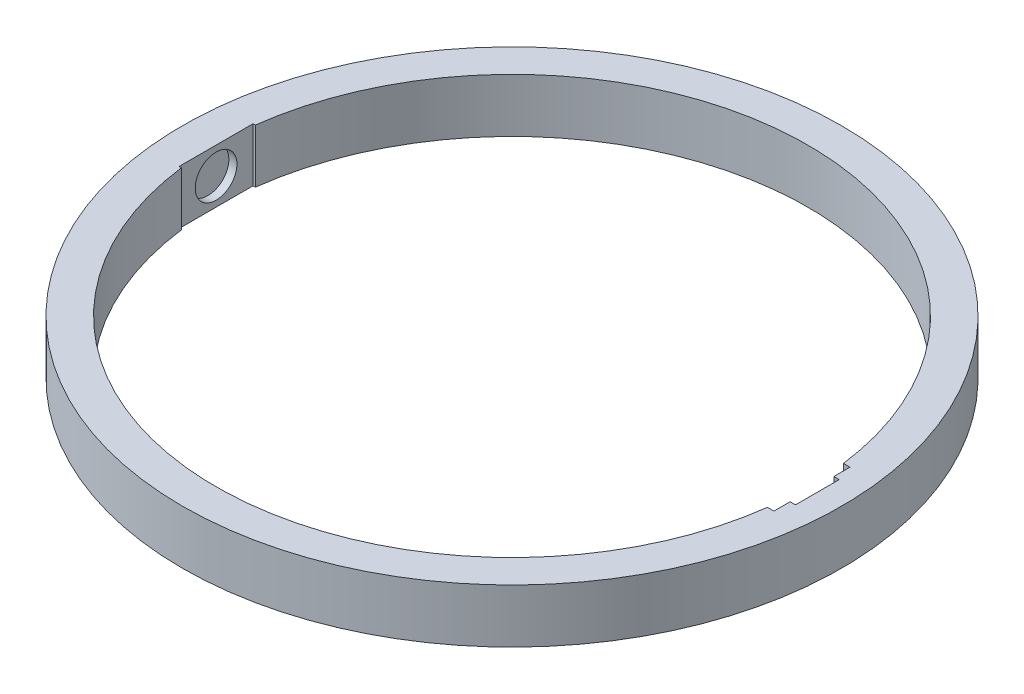
ISO-10303-21;
HEADER;
FILE_DESCRIPTION(('STEP AP214'),'2;1');
FILE_NAME('part.step','',(''),(''),'','','');
FILE_SCHEMA(('AUTOMOTIVE_DESIGN { 1 0 10303 214 1 1 1 1 }'));
ENDSEC;
DATA;
#1=APPLICATION_CONTEXT('core data for automotive mechanical design processes');
#2=APPLICATION_PROTOCOL_DEFINITION('international standard','automotive_design',2000,#1);
#3=PRODUCT_CONTEXT('',#1,'mechanical');
#4=PRODUCT('Part','Part','',(#3));
#5=PRODUCT_RELATED_PRODUCT_CATEGORY('part','',(#4));
#6=PRODUCT_DEFINITION_FORMATION('','',#4);
#7=PRODUCT_DEFINITION_CONTEXT('part definition',#1,'design');
#8=PRODUCT_DEFINITION('design','',#6,#7);
#9=PRODUCT_DEFINITION_SHAPE('','',#8);
#10=(LENGTH_UNIT() NAMED_UNIT(*) SI_UNIT(.MILLI.,.METRE.));
#11=(NAMED_UNIT(*) PLANE_ANGLE_UNIT() SI_UNIT($,.RADIAN.));
#12=(NAMED_UNIT(*) SI_UNIT($,.STERADIAN.) SOLID_ANGLE_UNIT());
#13=UNCERTAINTY_MEASURE_WITH_UNIT(LENGTH_MEASURE(1.E-05),#10,'distance_accuracy_value','');
#14=(GEOMETRIC_REPRESENTATION_CONTEXT(3) GLOBAL_UNCERTAINTY_ASSIGNED_CONTEXT((#13)) GLOBAL_UNIT_ASSIGNED_CONTEXT((#10,
#11,#12)) REPRESENTATION_CONTEXT('',''));
#15=CARTESIAN_POINT('',(0.,0.,0.));
#16=DIRECTION('',(0.,0.,1.));
#17=DIRECTION('',(1.,0.,0.));
#18=AXIS2_PLACEMENT_3D('',#15,#16,#17);
#19=CARTESIAN_POINT('',(0.,80.,0.));
#20=DIRECTION('',(0.,1.,0.));
#21=DIRECTION('',(0.,0.,1.));
#22=AXIS2_PLACEMENT_3D('',#19,#20,#21);
#23=PLANE('',#22);
#24=CARTESIAN_POINT('',(0.,80.,0.));
#25=DIRECTION('',(0.,1.,0.));
#26=DIRECTION('',(0.,0.,1.));
#27=AXIS2_PLACEMENT_3D('',#24,#25,#26);
#28=CIRCLE('',#27,490.);
#29=CARTESIAN_POINT('',(0.,80.,490.));
#30=VERTEX_POINT('',#29);
#31=EDGE_CURVE('E219',#30,#30,#28,.T.);
#32=ORIENTED_EDGE('',*,*,#31,.T.);
#33=EDGE_LOOP('',(#32));
#34=FACE_BOUND('',#33,.T.);
#35=DIRECTION('',(0.,0.,1.));
#36=VECTOR('',#35,1.);
#37=CARTESIAN_POINT('',(-440.,80.,-55.));
#38=LINE('',#37,#36);
#39=CARTESIAN_POINT('',(-440.,80.,-55.));
#40=VERTEX_POINT('',#39);
#41=CARTESIAN_POINT('',(-440.,80.,55.));
#42=VERTEX_POINT('',#41);
#43=EDGE_CURVE('E126',#40,#42,#38,.T.);
#44=ORIENTED_EDGE('',*,*,#43,.F.);
#45=DIRECTION('',(-1.,0.,0.));
#46=VECTOR('',#45,1.);
#47=CARTESIAN_POINT('',(-430.,80.,-55.));
#48=LINE('',#47,#46);
#49=CARTESIAN_POINT('',(-436.548966325657,80.,-55.));
#50=VERTEX_POINT('',#49);
#51=EDGE_CURVE('E129',#50,#40,#48,.T.);
#52=ORIENTED_EDGE('',*,*,#51,.F.);
#53=CARTESIAN_POINT('',(0.,80.,0.));
#54=DIRECTION('',(0.,1.,0.));
#55=DIRECTION('',(0.,0.,1.));
#56=AXIS2_PLACEMENT_3D('',#53,#54,#55);
#57=CIRCLE('',#56,440.);
#58=CARTESIAN_POINT('',(436.357365011753,80.,-56.5));
#59=VERTEX_POINT('',#58);
#60=EDGE_CURVE('E212',#59,#50,#57,.T.);
#61=ORIENTED_EDGE('',*,*,#60,.F.);
#62=DIRECTION('',(-1.,0.,0.));
#63=VECTOR('',#62,1.);
#64=CARTESIAN_POINT('',(0.,80.,-56.5));
#65=LINE('',#64,#63);
#66=CARTESIAN_POINT('',(446.,80.,-56.5));
#67=VERTEX_POINT('',#66);
#68=EDGE_CURVE('E59',#67,#59,#65,.T.);
#69=ORIENTED_EDGE('',*,*,#68,.F.);
#70=DIRECTION('',(0.,0.,-1.));
#71=VECTOR('',#70,1.);
#72=CARTESIAN_POINT('',(446.,80.,0.));
#73=LINE('',#72,#71);
#74=CARTESIAN_POINT('',(446.,80.,-32.5));
#75=VERTEX_POINT('',#74);
#76=EDGE_CURVE('E209',#75,#67,#73,.T.);
#77=ORIENTED_EDGE('',*,*,#76,.F.);
#78=DIRECTION('',(-1.,0.,0.));
#79=VECTOR('',#78,1.);
#80=CARTESIAN_POINT('',(0.,80.,-32.5));
#81=LINE('',#80,#79);
#82=CARTESIAN_POINT('',(454.,80.,-32.5));
#83=VERTEX_POINT('',#82);
#84=EDGE_CURVE('E207',#83,#75,#81,.T.);
#85=ORIENTED_EDGE('',*,*,#84,.F.);
#86=DIRECTION('',(0.,0.,-1.));
#87=VECTOR('',#86,1.);
#88=CARTESIAN_POINT('',(454.,80.,0.));
#89=LINE('',#88,#87);
#90=CARTESIAN_POINT('',(454.,80.,32.5));
#91=VERTEX_POINT('',#90);
#92=EDGE_CURVE('E205',#91,#83,#89,.T.);
#93=ORIENTED_EDGE('',*,*,#92,.F.);
#94=DIRECTION('',(1.,0.,0.));
#95=VECTOR('',#94,1.);
#96=CARTESIAN_POINT('',(0.,80.,32.5));
#97=LINE('',#96,#95);
#98=CARTESIAN_POINT('',(446.,80.,32.5));
#99=VERTEX_POINT('',#98);
#100=EDGE_CURVE('E203',#99,#91,#97,.T.);
#101=ORIENTED_EDGE('',*,*,#100,.F.);
#102=DIRECTION('',(0.,0.,-1.));
#103=VECTOR('',#102,1.);
#104=CARTESIAN_POINT('',(446.,80.,0.));
#105=LINE('',#104,#103);
#106=CARTESIAN_POINT('',(446.,80.,56.5));
#107=VERTEX_POINT('',#106);
#108=EDGE_CURVE('E201',#107,#99,#105,.T.);
#109=ORIENTED_EDGE('',*,*,#108,.F.);
#110=DIRECTION('',(1.,0.,0.));
#111=VECTOR('',#110,1.);
#112=CARTESIAN_POINT('',(0.,80.,56.5));
#113=LINE('',#112,#111);
#114=CARTESIAN_POINT('',(436.357365011753,80.,56.5));
#115=VERTEX_POINT('',#114);
#116=EDGE_CURVE('E199',#115,#107,#113,.T.);
#117=ORIENTED_EDGE('',*,*,#116,.F.);
#118=CARTESIAN_POINT('',(-436.548966325657,80.,55.));
#119=VERTEX_POINT('',#118);
#120=EDGE_CURVE('E215',#119,#115,#57,.T.);
#121=ORIENTED_EDGE('',*,*,#120,.F.);
#122=DIRECTION('',(-1.,0.,0.));
#123=VECTOR('',#122,1.);
#124=CARTESIAN_POINT('',(-430.,80.,55.));
#125=LINE('',#124,#123);
#126=EDGE_CURVE('E51',#119,#42,#125,.T.);
#127=ORIENTED_EDGE('',*,*,#126,.T.);
#128=EDGE_LOOP('',(#44,#52,#61,#69,#77,#85,#93,#101,#109,#117,#121,#127));
#129=FACE_BOUND('',#128,.T.);
#130=ADVANCED_FACE('F36',(#34,#129),#23,.T.);
#131=CARTESIAN_POINT('',(0.,0.,0.));
#132=DIRECTION('',(0.,1.,0.));
#133=DIRECTION('',(0.,0.,1.));
#134=AXIS2_PLACEMENT_3D('',#131,#132,#133);
#135=PLANE('',#134);
#136=CARTESIAN_POINT('',(0.,0.,0.));
#137=DIRECTION('',(0.,1.,0.));
#138=DIRECTION('',(0.,0.,1.));
#139=AXIS2_PLACEMENT_3D('',#136,#137,#138);
#140=CIRCLE('',#139,490.);
#141=CARTESIAN_POINT('',(0.,0.,490.));
#142=VERTEX_POINT('',#141);
#143=EDGE_CURVE('E214',#142,#142,#140,.T.);
#144=ORIENTED_EDGE('',*,*,#143,.F.);
#145=EDGE_LOOP('',(#144));
#146=FACE_BOUND('',#145,.T.);
#147=DIRECTION('',(-1.,0.,0.));
#148=VECTOR('',#147,1.);
#149=CARTESIAN_POINT('',(-430.,0.,-55.));
#150=LINE('',#149,#148);
#151=CARTESIAN_POINT('',(-436.548966325657,0.,-55.));
#152=VERTEX_POINT('',#151);
#153=CARTESIAN_POINT('',(-440.,0.,-55.));
#154=VERTEX_POINT('',#153);
#155=EDGE_CURVE('E155',#152,#154,#150,.T.);
#156=ORIENTED_EDGE('',*,*,#155,.T.);
#157=DIRECTION('',(0.,0.,-1.));
#158=VECTOR('',#157,1.);
#159=CARTESIAN_POINT('',(-440.,0.,55.));
#160=LINE('',#159,#158);
#161=CARTESIAN_POINT('',(-440.,0.,55.));
#162=VERTEX_POINT('',#161);
#163=EDGE_CURVE('E145',#162,#154,#160,.T.);
#164=ORIENTED_EDGE('',*,*,#163,.F.);
#165=DIRECTION('',(-1.,0.,0.));
#166=VECTOR('',#165,1.);
#167=CARTESIAN_POINT('',(-430.,0.,55.));
#168=LINE('',#167,#166);
#169=CARTESIAN_POINT('',(-436.548966325657,0.,55.));
#170=VERTEX_POINT('',#169);
#171=EDGE_CURVE('E157',#170,#162,#168,.T.);
#172=ORIENTED_EDGE('',*,*,#171,.F.);
#173=CARTESIAN_POINT('',(0.,0.,0.));
#174=DIRECTION('',(0.,1.,0.));
#175=DIRECTION('',(0.,0.,1.));
#176=AXIS2_PLACEMENT_3D('',#173,#174,#175);
#177=CIRCLE('',#176,440.);
#178=CARTESIAN_POINT('',(436.357365011753,0.,56.5));
#179=VERTEX_POINT('',#178);
#180=EDGE_CURVE('E211',#170,#179,#177,.T.);
#181=ORIENTED_EDGE('',*,*,#180,.T.);
#182=DIRECTION('',(1.,0.,0.));
#183=VECTOR('',#182,1.);
#184=CARTESIAN_POINT('',(446.,0.,56.5));
#185=LINE('',#184,#183);
#186=CARTESIAN_POINT('',(446.,0.,56.5));
#187=VERTEX_POINT('',#186);
#188=EDGE_CURVE('E166',#179,#187,#185,.T.);
#189=ORIENTED_EDGE('',*,*,#188,.T.);
#190=DIRECTION('',(0.,0.,-1.));
#191=VECTOR('',#190,1.);
#192=CARTESIAN_POINT('',(446.,0.,32.5));
#193=LINE('',#192,#191);
#194=CARTESIAN_POINT('',(446.,0.,32.5));
#195=VERTEX_POINT('',#194);
#196=EDGE_CURVE('E169',#187,#195,#193,.T.);
#197=ORIENTED_EDGE('',*,*,#196,.T.);
#198=DIRECTION('',(1.,0.,0.));
#199=VECTOR('',#198,1.);
#200=CARTESIAN_POINT('',(454.,0.,32.5));
#201=LINE('',#200,#199);
#202=CARTESIAN_POINT('',(454.,0.,32.5));
#203=VERTEX_POINT('',#202);
#204=EDGE_CURVE('E172',#195,#203,#201,.T.);
#205=ORIENTED_EDGE('',*,*,#204,.T.);
#206=DIRECTION('',(0.,0.,-1.));
#207=VECTOR('',#206,1.);
#208=CARTESIAN_POINT('',(454.,0.,-32.5));
#209=LINE('',#208,#207);
#210=CARTESIAN_POINT('',(454.,0.,-32.5));
#211=VERTEX_POINT('',#210);
#212=EDGE_CURVE('E175',#203,#211,#209,.T.);
#213=ORIENTED_EDGE('',*,*,#212,.T.);
#214=DIRECTION('',(-1.,0.,0.));
#215=VECTOR('',#214,1.);
#216=CARTESIAN_POINT('',(446.,0.,-32.5));
#217=LINE('',#216,#215);
#218=CARTESIAN_POINT('',(446.,0.,-32.5));
#219=VERTEX_POINT('',#218);
#220=EDGE_CURVE('E178',#211,#219,#217,.T.);
#221=ORIENTED_EDGE('',*,*,#220,.T.);
#222=DIRECTION('',(0.,0.,-1.));
#223=VECTOR('',#222,1.);
#224=CARTESIAN_POINT('',(446.,0.,-56.5));
#225=LINE('',#224,#223);
#226=CARTESIAN_POINT('',(446.,0.,-56.5));
#227=VERTEX_POINT('',#226);
#228=EDGE_CURVE('E142',#219,#227,#225,.T.);
#229=ORIENTED_EDGE('',*,*,#228,.T.);
#230=DIRECTION('',(-1.,0.,0.));
#231=VECTOR('',#230,1.);
#232=CARTESIAN_POINT('',(366.03,0.,-56.5));
#233=LINE('',#232,#231);
#234=CARTESIAN_POINT('',(436.357365011753,0.,-56.5));
#235=VERTEX_POINT('',#234);
#236=EDGE_CURVE('E163',#227,#235,#233,.T.);
#237=ORIENTED_EDGE('',*,*,#236,.T.);
#238=EDGE_CURVE('E216',#235,#152,#177,.T.);
#239=ORIENTED_EDGE('',*,*,#238,.T.);
#240=EDGE_LOOP('',(#156,#164,#172,#181,#189,#197,#205,#213,#221,#229,#237,#239));
#241=FACE_BOUND('',#240,.T.);
#242=ADVANCED_FACE('F244',(#146,#241),#135,.F.);
#243=CARTESIAN_POINT('',(0.,80.,0.));
#244=DIRECTION('',(0.,-1.,0.));
#245=DIRECTION('',(0.,0.,-1.));
#246=AXIS2_PLACEMENT_3D('',#243,#244,#245);
#247=CYLINDRICAL_SURFACE('',#246,440.);
#248=ORIENTED_EDGE('',*,*,#60,.T.);
#249=DIRECTION('',(0.,-1.,0.));
#250=VECTOR('',#249,1.);
#251=CARTESIAN_POINT('',(-436.548966325657,80.,-55.));
#252=LINE('',#251,#250);
#253=EDGE_CURVE('E11',#50,#152,#252,.T.);
#254=ORIENTED_EDGE('',*,*,#253,.T.);
#255=ORIENTED_EDGE('',*,*,#238,.F.);
#256=DIRECTION('',(0.,-1.,0.));
#257=VECTOR('',#256,1.);
#258=CARTESIAN_POINT('',(436.357365011753,80.,-56.5));
#259=LINE('',#258,#257);
#260=EDGE_CURVE('E222',#59,#235,#259,.T.);
#261=ORIENTED_EDGE('',*,*,#260,.F.);
#262=EDGE_LOOP('',(#248,#254,#255,#261));
#263=FACE_BOUND('',#262,.T.);
#264=ADVANCED_FACE('F264',(#263),#247,.F.);
#265=ORIENTED_EDGE('',*,*,#180,.F.);
#266=DIRECTION('',(0.,-1.,0.));
#267=VECTOR('',#266,1.);
#268=CARTESIAN_POINT('',(-436.548966325657,80.,55.));
#269=LINE('',#268,#267);
#270=EDGE_CURVE('E44',#170,#119,#269,.F.);
#271=ORIENTED_EDGE('',*,*,#270,.T.);
#272=ORIENTED_EDGE('',*,*,#120,.T.);
#273=DIRECTION('',(0.,-1.,0.));
#274=VECTOR('',#273,1.);
#275=CARTESIAN_POINT('',(436.357365011753,80.,56.5));
#276=LINE('',#275,#274);
#277=EDGE_CURVE('E226',#179,#115,#276,.F.);
#278=ORIENTED_EDGE('',*,*,#277,.F.);
#279=EDGE_LOOP('',(#265,#271,#272,#278));
#280=FACE_BOUND('',#279,.T.);
#281=ADVANCED_FACE('F230',(#280),#247,.F.);
#282=CARTESIAN_POINT('',(0.,80.,0.));
#283=DIRECTION('',(0.,-1.,0.));
#284=DIRECTION('',(0.,0.,-1.));
#285=AXIS2_PLACEMENT_3D('',#282,#283,#284);
#286=CYLINDRICAL_SURFACE('',#285,490.);
#287=ORIENTED_EDGE('',*,*,#31,.F.);
#288=EDGE_LOOP('',(#287));
#289=FACE_BOUND('',#288,.T.);
#290=ORIENTED_EDGE('',*,*,#143,.T.);
#291=EDGE_LOOP('',(#290));
#292=FACE_BOUND('',#291,.T.);
#293=ADVANCED_FACE('F38',(#289,#292),#286,.T.);
#294=CARTESIAN_POINT('',(446.,0.,-56.5));
#295=DIRECTION('',(1.,0.,0.));
#296=DIRECTION('',(0.,0.,-1.));
#297=AXIS2_PLACEMENT_3D('',#294,#295,#296);
#298=PLANE('',#297);
#299=ORIENTED_EDGE('',*,*,#76,.T.);
#300=DIRECTION('',(0.,1.,0.));
#301=VECTOR('',#300,1.);
#302=CARTESIAN_POINT('',(446.,0.,-56.5));
#303=LINE('',#302,#301);
#304=EDGE_CURVE('E181',#227,#67,#303,.T.);
#305=ORIENTED_EDGE('',*,*,#304,.F.);
#306=ORIENTED_EDGE('',*,*,#228,.F.);
#307=DIRECTION('',(0.,1.,0.));
#308=VECTOR('',#307,1.);
#309=CARTESIAN_POINT('',(446.,0.,-32.5));
#310=LINE('',#309,#308);
#311=EDGE_CURVE('E182',#219,#75,#310,.T.);
#312=ORIENTED_EDGE('',*,*,#311,.T.);
#313=EDGE_LOOP('',(#299,#305,#306,#312));
#314=FACE_BOUND('',#313,.T.);
#315=ADVANCED_FACE('F270',(#314),#298,.F.);
#316=CARTESIAN_POINT('',(446.,0.,-32.5));
#317=DIRECTION('',(0.,0.,-1.));
#318=DIRECTION('',(-1.,0.,0.));
#319=AXIS2_PLACEMENT_3D('',#316,#317,#318);
#320=PLANE('',#319);
#321=ORIENTED_EDGE('',*,*,#84,.T.);
#322=ORIENTED_EDGE('',*,*,#311,.F.);
#323=ORIENTED_EDGE('',*,*,#220,.F.);
#324=DIRECTION('',(0.,1.,0.));
#325=VECTOR('',#324,1.);
#326=CARTESIAN_POINT('',(454.,0.,-32.5));
#327=LINE('',#326,#325);
#328=EDGE_CURVE('E185',#211,#83,#327,.T.);
#329=ORIENTED_EDGE('',*,*,#328,.T.);
#330=EDGE_LOOP('',(#321,#322,#323,#329));
#331=FACE_BOUND('',#330,.T.);
#332=ADVANCED_FACE('F273',(#331),#320,.F.);
#333=CARTESIAN_POINT('',(454.,0.,-32.5));
#334=DIRECTION('',(1.,0.,0.));
#335=DIRECTION('',(0.,0.,-1.));
#336=AXIS2_PLACEMENT_3D('',#333,#334,#335);
#337=PLANE('',#336);
#338=ORIENTED_EDGE('',*,*,#92,.T.);
#339=ORIENTED_EDGE('',*,*,#328,.F.);
#340=ORIENTED_EDGE('',*,*,#212,.F.);
#341=DIRECTION('',(0.,1.,0.));
#342=VECTOR('',#341,1.);
#343=CARTESIAN_POINT('',(454.,0.,32.5));
#344=LINE('',#343,#342);
#345=EDGE_CURVE('E188',#203,#91,#344,.T.);
#346=ORIENTED_EDGE('',*,*,#345,.T.);
#347=EDGE_LOOP('',(#338,#339,#340,#346));
#348=FACE_BOUND('',#347,.T.);
#349=ADVANCED_FACE('F285',(#348),#337,.F.);
#350=CARTESIAN_POINT('',(454.,0.,32.5));
#351=DIRECTION('',(0.,0.,1.));
#352=DIRECTION('',(1.,0.,0.));
#353=AXIS2_PLACEMENT_3D('',#350,#351,#352);
#354=PLANE('',#353);
#355=ORIENTED_EDGE('',*,*,#100,.T.);
#356=ORIENTED_EDGE('',*,*,#345,.F.);
#357=ORIENTED_EDGE('',*,*,#204,.F.);
#358=DIRECTION('',(0.,1.,0.));
#359=VECTOR('',#358,1.);
#360=CARTESIAN_POINT('',(446.,0.,32.5));
#361=LINE('',#360,#359);
#362=EDGE_CURVE('E191',#195,#99,#361,.T.);
#363=ORIENTED_EDGE('',*,*,#362,.T.);
#364=EDGE_LOOP('',(#355,#356,#357,#363));
#365=FACE_BOUND('',#364,.T.);
#366=ADVANCED_FACE('F282',(#365),#354,.F.);
#367=CARTESIAN_POINT('',(446.,0.,32.5));
#368=DIRECTION('',(1.,0.,0.));
#369=DIRECTION('',(0.,0.,-1.));
#370=AXIS2_PLACEMENT_3D('',#367,#368,#369);
#371=PLANE('',#370);
#372=ORIENTED_EDGE('',*,*,#108,.T.);
#373=ORIENTED_EDGE('',*,*,#362,.F.);
#374=ORIENTED_EDGE('',*,*,#196,.F.);
#375=DIRECTION('',(0.,1.,0.));
#376=VECTOR('',#375,1.);
#377=CARTESIAN_POINT('',(446.,0.,56.5));
#378=LINE('',#377,#376);
#379=EDGE_CURVE('E194',#187,#107,#378,.T.);
#380=ORIENTED_EDGE('',*,*,#379,.T.);
#381=EDGE_LOOP('',(#372,#373,#374,#380));
#382=FACE_BOUND('',#381,.T.);
#383=ADVANCED_FACE('F241',(#382),#371,.F.);
#384=CARTESIAN_POINT('',(446.,0.,56.5));
#385=DIRECTION('',(0.,0.,1.));
#386=DIRECTION('',(1.,0.,0.));
#387=AXIS2_PLACEMENT_3D('',#384,#385,#386);
#388=PLANE('',#387);
#389=ORIENTED_EDGE('',*,*,#116,.T.);
#390=ORIENTED_EDGE('',*,*,#379,.F.);
#391=ORIENTED_EDGE('',*,*,#188,.F.);
#392=ORIENTED_EDGE('',*,*,#277,.T.);
#393=EDGE_LOOP('',(#389,#390,#391,#392));
#394=FACE_BOUND('',#393,.T.);
#395=ADVANCED_FACE('F237',(#394),#388,.F.);
#396=CARTESIAN_POINT('',(366.03,0.,-56.5));
#397=DIRECTION('',(0.,0.,-1.));
#398=DIRECTION('',(-1.,0.,0.));
#399=AXIS2_PLACEMENT_3D('',#396,#397,#398);
#400=PLANE('',#399);
#401=ORIENTED_EDGE('',*,*,#68,.T.);
#402=ORIENTED_EDGE('',*,*,#260,.T.);
#403=ORIENTED_EDGE('',*,*,#236,.F.);
#404=ORIENTED_EDGE('',*,*,#304,.T.);
#405=EDGE_LOOP('',(#401,#402,#403,#404));
#406=FACE_BOUND('',#405,.T.);
#407=ADVANCED_FACE('F275',(#406),#400,.F.);
#408=CARTESIAN_POINT('',(-440.,0.,0.));
#409=DIRECTION('',(1.,0.,0.));
#410=DIRECTION('',(0.,0.,-1.));
#411=AXIS2_PLACEMENT_3D('',#408,#409,#410);
#412=PLANE('',#411);
#413=CARTESIAN_POINT('',(-440.,40.,0.));
#414=DIRECTION('',(1.,0.,0.));
#415=DIRECTION('',(0.,0.,-1.));
#416=AXIS2_PLACEMENT_3D('',#413,#414,#415);
#417=CIRCLE('',#416,31.);
#418=CARTESIAN_POINT('',(-440.,40.,-31.));
#419=VERTEX_POINT('',#418);
#420=EDGE_CURVE('E149',#419,#419,#417,.T.);
#421=ORIENTED_EDGE('',*,*,#420,.F.);
#422=EDGE_LOOP('',(#421));
#423=FACE_BOUND('',#422,.T.);
#424=DIRECTION('',(0.,1.,0.));
#425=VECTOR('',#424,1.);
#426=CARTESIAN_POINT('',(-440.,0.,-55.));
#427=LINE('',#426,#425);
#428=EDGE_CURVE('E136',#154,#40,#427,.T.);
#429=ORIENTED_EDGE('',*,*,#428,.T.);
#430=ORIENTED_EDGE('',*,*,#43,.T.);
#431=DIRECTION('',(0.,-1.,0.));
#432=VECTOR('',#431,1.);
#433=CARTESIAN_POINT('',(-440.,80.,55.));
#434=LINE('',#433,#432);
#435=EDGE_CURVE('E135',#42,#162,#434,.T.);
#436=ORIENTED_EDGE('',*,*,#435,.T.);
#437=ORIENTED_EDGE('',*,*,#163,.T.);
#438=EDGE_LOOP('',(#429,#430,#436,#437));
#439=FACE_BOUND('',#438,.T.);
#440=ADVANCED_FACE('F144',(#423,#439),#412,.T.);
#441=CARTESIAN_POINT('',(-430.,0.,-55.));
#442=DIRECTION('',(0.,0.,1.));
#443=DIRECTION('',(0.,-1.,0.));
#444=AXIS2_PLACEMENT_3D('',#441,#442,#443);
#445=PLANE('',#444);
#446=ORIENTED_EDGE('',*,*,#51,.T.);
#447=ORIENTED_EDGE('',*,*,#428,.F.);
#448=ORIENTED_EDGE('',*,*,#155,.F.);
#449=ORIENTED_EDGE('',*,*,#253,.F.);
#450=EDGE_LOOP('',(#446,#447,#448,#449));
#451=FACE_BOUND('',#450,.T.);
#452=ADVANCED_FACE('F140',(#451),#445,.T.);
#453=CARTESIAN_POINT('',(-430.,80.,55.));
#454=DIRECTION('',(0.,0.,-1.));
#455=DIRECTION('',(0.,1.,0.));
#456=AXIS2_PLACEMENT_3D('',#453,#454,#455);
#457=PLANE('',#456);
#458=ORIENTED_EDGE('',*,*,#171,.T.);
#459=ORIENTED_EDGE('',*,*,#435,.F.);
#460=ORIENTED_EDGE('',*,*,#126,.F.);
#461=ORIENTED_EDGE('',*,*,#270,.F.);
#462=EDGE_LOOP('',(#458,#459,#460,#461));
#463=FACE_BOUND('',#462,.T.);
#464=ADVANCED_FACE('F245',(#463),#457,.T.);
#465=CARTESIAN_POINT('',(-452.,40.,0.));
#466=DIRECTION('',(1.,0.,0.));
#467=DIRECTION('',(0.,0.,-1.));
#468=AXIS2_PLACEMENT_3D('',#465,#466,#467);
#469=CYLINDRICAL_SURFACE('',#468,31.);
#470=CARTESIAN_POINT('',(-452.,40.,0.));
#471=DIRECTION('',(1.,0.,0.));
#472=DIRECTION('',(0.,0.,-1.));
#473=AXIS2_PLACEMENT_3D('',#470,#471,#472);
#474=CIRCLE('',#473,31.);
#475=CARTESIAN_POINT('',(-452.,40.,-31.));
#476=VERTEX_POINT('',#475);
#477=EDGE_CURVE('E146',#476,#476,#474,.T.);
#478=ORIENTED_EDGE('',*,*,#477,.F.);
#479=EDGE_LOOP('',(#478));
#480=FACE_BOUND('',#479,.T.);
#481=ORIENTED_EDGE('',*,*,#420,.T.);
#482=EDGE_LOOP('',(#481));
#483=FACE_BOUND('',#482,.T.);
#484=ADVANCED_FACE('F247',(#480,#483),#469,.F.);
#485=CARTESIAN_POINT('',(-452.,40.,0.));
#486=DIRECTION('',(1.,0.,0.));
#487=DIRECTION('',(0.,0.,-1.));
#488=AXIS2_PLACEMENT_3D('',#485,#486,#487);
#489=PLANE('',#488);
#490=ORIENTED_EDGE('',*,*,#477,.T.);
#491=EDGE_LOOP('',(#490));
#492=FACE_BOUND('',#491,.T.);
#493=ADVANCED_FACE('F253',(#492),#489,.T.);
#494=CLOSED_SHELL('',(#130,#242,#264,#281,#293,#315,#332,#349,#366,#383,#395,#407,#440,#452,
#464,#484,#493));
#495=MANIFOLD_SOLID_BREP('B2',#494);
#496=ADVANCED_BREP_SHAPE_REPRESENTATION('',(#18,#495),#14);
#497=SHAPE_DEFINITION_REPRESENTATION(#9,#496);
ENDSEC;
END-ISO-10303-21;
